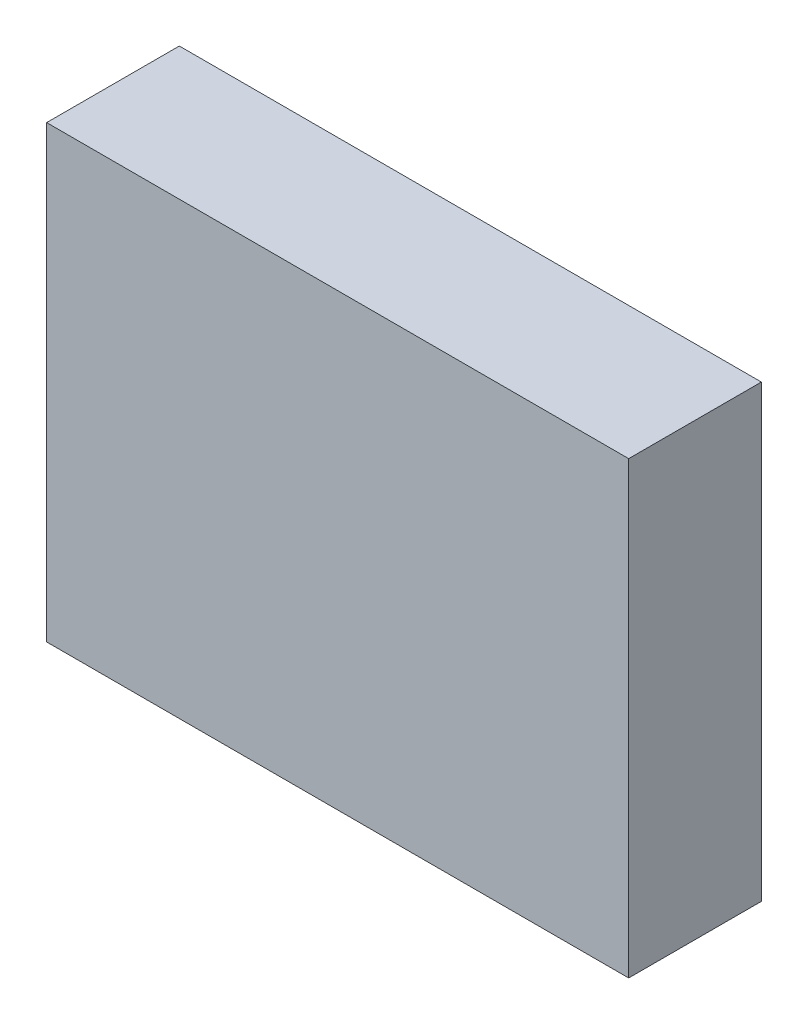
ISO-10303-21;
HEADER;
FILE_DESCRIPTION(('STEP AP214'),'2;1');
FILE_NAME('part.step','',(''),(''),'','','');
FILE_SCHEMA(('AUTOMOTIVE_DESIGN { 1 0 10303 214 1 1 1 1 }'));
ENDSEC;
DATA;
#1=APPLICATION_CONTEXT('core data for automotive mechanical design processes');
#2=APPLICATION_PROTOCOL_DEFINITION('international standard','automotive_design',2000,#1);
#3=PRODUCT_CONTEXT('',#1,'mechanical');
#4=PRODUCT('Part','Part','',(#3));
#5=PRODUCT_RELATED_PRODUCT_CATEGORY('part','',(#4));
#6=PRODUCT_DEFINITION_FORMATION('','',#4);
#7=PRODUCT_DEFINITION_CONTEXT('part definition',#1,'design');
#8=PRODUCT_DEFINITION('design','',#6,#7);
#9=PRODUCT_DEFINITION_SHAPE('','',#8);
#10=(LENGTH_UNIT() NAMED_UNIT(*) SI_UNIT(.MILLI.,.METRE.));
#11=(NAMED_UNIT(*) PLANE_ANGLE_UNIT() SI_UNIT($,.RADIAN.));
#12=(NAMED_UNIT(*) SI_UNIT($,.STERADIAN.) SOLID_ANGLE_UNIT());
#13=UNCERTAINTY_MEASURE_WITH_UNIT(LENGTH_MEASURE(1.E-05),#10,'distance_accuracy_value','');
#14=(GEOMETRIC_REPRESENTATION_CONTEXT(3) GLOBAL_UNCERTAINTY_ASSIGNED_CONTEXT((#13)) GLOBAL_UNIT_ASSIGNED_CONTEXT((#10,
#11,#12)) REPRESENTATION_CONTEXT('',''));
#15=CARTESIAN_POINT('',(0.,0.,0.));
#16=DIRECTION('',(0.,0.,1.));
#17=DIRECTION('',(1.,0.,0.));
#18=AXIS2_PLACEMENT_3D('',#15,#16,#17);
#19=CARTESIAN_POINT('',(-72.1839758075475,31.6058907532693,10.));
#20=DIRECTION('',(1.,0.,0.));
#21=DIRECTION('',(0.,0.,-1.));
#22=AXIS2_PLACEMENT_3D('',#19,#20,#21);
#23=PLANE('',#22);
#24=DIRECTION('',(0.,-1.,0.));
#25=VECTOR('',#24,1.);
#26=CARTESIAN_POINT('',(-72.1839758075475,31.6058907532693,0.));
#27=LINE('',#26,#25);
#28=CARTESIAN_POINT('',(-72.1839758075475,31.6058907532693,0.));
#29=VERTEX_POINT('',#28);
#30=CARTESIAN_POINT('',(-72.1839758075475,-2.29964540341143,0.));
#31=VERTEX_POINT('',#30);
#32=EDGE_CURVE('E111',#29,#31,#27,.T.);
#33=ORIENTED_EDGE('',*,*,#32,.T.);
#34=DIRECTION('',(0.,0.,-1.));
#35=VECTOR('',#34,1.);
#36=CARTESIAN_POINT('',(-72.1839758075475,-2.29964540341143,10.));
#37=LINE('',#36,#35);
#38=CARTESIAN_POINT('',(-72.1839758075475,-2.29964540341143,10.));
#39=VERTEX_POINT('',#38);
#40=EDGE_CURVE('E11',#39,#31,#37,.T.);
#41=ORIENTED_EDGE('',*,*,#40,.F.);
#42=DIRECTION('',(0.,-1.,0.));
#43=VECTOR('',#42,1.);
#44=CARTESIAN_POINT('',(-72.1839758075475,31.6058907532693,10.));
#45=LINE('',#44,#43);
#46=CARTESIAN_POINT('',(-72.1839758075475,31.6058907532693,10.));
#47=VERTEX_POINT('',#46);
#48=EDGE_CURVE('E95',#47,#39,#45,.T.);
#49=ORIENTED_EDGE('',*,*,#48,.F.);
#50=DIRECTION('',(0.,0.,-1.));
#51=VECTOR('',#50,1.);
#52=CARTESIAN_POINT('',(-72.1839758075475,31.6058907532693,10.));
#53=LINE('',#52,#51);
#54=EDGE_CURVE('E107',#47,#29,#53,.T.);
#55=ORIENTED_EDGE('',*,*,#54,.T.);
#56=EDGE_LOOP('',(#33,#41,#49,#55));
#57=FACE_BOUND('',#56,.T.);
#58=ADVANCED_FACE('F43',(#57),#23,.F.);
#59=CARTESIAN_POINT('',(-72.1839758075475,-2.29964540341143,10.));
#60=DIRECTION('',(0.,1.,0.));
#61=DIRECTION('',(0.,0.,1.));
#62=AXIS2_PLACEMENT_3D('',#59,#60,#61);
#63=PLANE('',#62);
#64=DIRECTION('',(1.,0.,0.));
#65=VECTOR('',#64,1.);
#66=CARTESIAN_POINT('',(-72.1839758075475,-2.29964540341143,0.));
#67=LINE('',#66,#65);
#68=CARTESIAN_POINT('',(-28.3100185305329,-2.29964540341143,0.));
#69=VERTEX_POINT('',#68);
#70=EDGE_CURVE('E100',#31,#69,#67,.T.);
#71=ORIENTED_EDGE('',*,*,#70,.T.);
#72=DIRECTION('',(0.,0.,-1.));
#73=VECTOR('',#72,1.);
#74=CARTESIAN_POINT('',(-28.3100185305329,-2.29964540341143,10.));
#75=LINE('',#74,#73);
#76=CARTESIAN_POINT('',(-28.3100185305329,-2.29964540341143,10.));
#77=VERTEX_POINT('',#76);
#78=EDGE_CURVE('E52',#77,#69,#75,.T.);
#79=ORIENTED_EDGE('',*,*,#78,.F.);
#80=DIRECTION('',(1.,0.,0.));
#81=VECTOR('',#80,1.);
#82=CARTESIAN_POINT('',(-72.1839758075475,-2.29964540341143,10.));
#83=LINE('',#82,#81);
#84=EDGE_CURVE('E90',#39,#77,#83,.T.);
#85=ORIENTED_EDGE('',*,*,#84,.F.);
#86=ORIENTED_EDGE('',*,*,#40,.T.);
#87=EDGE_LOOP('',(#71,#79,#85,#86));
#88=FACE_BOUND('',#87,.T.);
#89=ADVANCED_FACE('F99',(#88),#63,.F.);
#90=CARTESIAN_POINT('',(-28.3100185305329,31.6058907532693,10.));
#91=DIRECTION('',(-1.,0.,0.));
#92=DIRECTION('',(0.,0.,1.));
#93=AXIS2_PLACEMENT_3D('',#90,#91,#92);
#94=PLANE('',#93);
#95=DIRECTION('',(0.,1.,0.));
#96=VECTOR('',#95,1.);
#97=CARTESIAN_POINT('',(-28.3100185305329,31.6058907532693,0.));
#98=LINE('',#97,#96);
#99=CARTESIAN_POINT('',(-28.3100185305329,31.6058907532693,0.));
#100=VERTEX_POINT('',#99);
#101=EDGE_CURVE('E77',#69,#100,#98,.T.);
#102=ORIENTED_EDGE('',*,*,#101,.T.);
#103=DIRECTION('',(0.,0.,-1.));
#104=VECTOR('',#103,1.);
#105=CARTESIAN_POINT('',(-28.3100185305329,31.6058907532693,10.));
#106=LINE('',#105,#104);
#107=CARTESIAN_POINT('',(-28.3100185305329,31.6058907532693,10.));
#108=VERTEX_POINT('',#107);
#109=EDGE_CURVE('E102',#108,#100,#106,.T.);
#110=ORIENTED_EDGE('',*,*,#109,.F.);
#111=DIRECTION('',(0.,1.,0.));
#112=VECTOR('',#111,1.);
#113=CARTESIAN_POINT('',(-28.3100185305329,31.6058907532693,10.));
#114=LINE('',#113,#112);
#115=EDGE_CURVE('E93',#77,#108,#114,.T.);
#116=ORIENTED_EDGE('',*,*,#115,.F.);
#117=ORIENTED_EDGE('',*,*,#78,.T.);
#118=EDGE_LOOP('',(#102,#110,#116,#117));
#119=FACE_BOUND('',#118,.T.);
#120=ADVANCED_FACE('F103',(#119),#94,.F.);
#121=CARTESIAN_POINT('',(-72.1839758075475,31.6058907532693,10.));
#122=DIRECTION('',(0.,-1.,0.));
#123=DIRECTION('',(0.,0.,-1.));
#124=AXIS2_PLACEMENT_3D('',#121,#122,#123);
#125=PLANE('',#124);
#126=DIRECTION('',(-1.,0.,0.));
#127=VECTOR('',#126,1.);
#128=CARTESIAN_POINT('',(-72.1839758075475,31.6058907532693,0.));
#129=LINE('',#128,#127);
#130=EDGE_CURVE('E83',#100,#29,#129,.T.);
#131=ORIENTED_EDGE('',*,*,#130,.T.);
#132=ORIENTED_EDGE('',*,*,#54,.F.);
#133=DIRECTION('',(-1.,0.,0.));
#134=VECTOR('',#133,1.);
#135=CARTESIAN_POINT('',(-72.1839758075475,31.6058907532693,10.));
#136=LINE('',#135,#134);
#137=EDGE_CURVE('E60',#108,#47,#136,.T.);
#138=ORIENTED_EDGE('',*,*,#137,.F.);
#139=ORIENTED_EDGE('',*,*,#109,.T.);
#140=EDGE_LOOP('',(#131,#132,#138,#139));
#141=FACE_BOUND('',#140,.T.);
#142=ADVANCED_FACE('F124',(#141),#125,.F.);
#143=CARTESIAN_POINT('',(0.,0.,10.));
#144=DIRECTION('',(0.,0.,1.));
#145=DIRECTION('',(1.,0.,0.));
#146=AXIS2_PLACEMENT_3D('',#143,#144,#145);
#147=PLANE('',#146);
#148=ORIENTED_EDGE('',*,*,#48,.T.);
#149=ORIENTED_EDGE('',*,*,#84,.T.);
#150=ORIENTED_EDGE('',*,*,#115,.T.);
#151=ORIENTED_EDGE('',*,*,#137,.T.);
#152=EDGE_LOOP('',(#148,#149,#150,#151));
#153=FACE_BOUND('',#152,.T.);
#154=ADVANCED_FACE('F91',(#153),#147,.T.);
#155=CARTESIAN_POINT('',(0.,0.,0.));
#156=DIRECTION('',(0.,0.,1.));
#157=DIRECTION('',(1.,0.,0.));
#158=AXIS2_PLACEMENT_3D('',#155,#156,#157);
#159=PLANE('',#158);
#160=ORIENTED_EDGE('',*,*,#32,.F.);
#161=ORIENTED_EDGE('',*,*,#130,.F.);
#162=ORIENTED_EDGE('',*,*,#101,.F.);
#163=ORIENTED_EDGE('',*,*,#70,.F.);
#164=EDGE_LOOP('',(#160,#161,#162,#163));
#165=FACE_BOUND('',#164,.T.);
#166=ADVANCED_FACE('F127',(#165),#159,.F.);
#167=CLOSED_SHELL('',(#58,#89,#120,#142,#154,#166));
#168=MANIFOLD_SOLID_BREP('B2',#167);
#169=ADVANCED_BREP_SHAPE_REPRESENTATION('',(#18,#168),#14);
#170=SHAPE_DEFINITION_REPRESENTATION(#9,#169);
ENDSEC;
END-ISO-10303-21;
